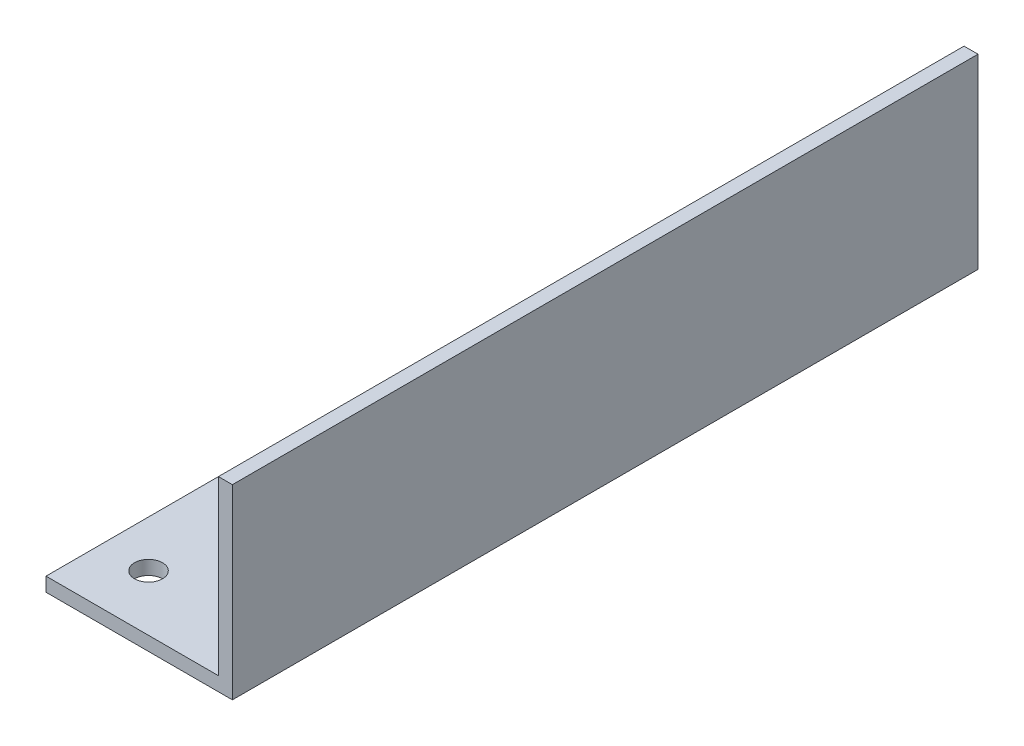
ISO-10303-21;
HEADER;
FILE_DESCRIPTION(('STEP AP214'),'2;1');
FILE_NAME('part.step','',(''),(''),'','','');
FILE_SCHEMA(('AUTOMOTIVE_DESIGN { 1 0 10303 214 1 1 1 1 }'));
ENDSEC;
DATA;
#1=APPLICATION_CONTEXT('core data for automotive mechanical design processes');
#2=APPLICATION_PROTOCOL_DEFINITION('international standard','automotive_design',2000,#1);
#3=PRODUCT_CONTEXT('',#1,'mechanical');
#4=PRODUCT('Part','Part','',(#3));
#5=PRODUCT_RELATED_PRODUCT_CATEGORY('part','',(#4));
#6=PRODUCT_DEFINITION_FORMATION('','',#4);
#7=PRODUCT_DEFINITION_CONTEXT('part definition',#1,'design');
#8=PRODUCT_DEFINITION('design','',#6,#7);
#9=PRODUCT_DEFINITION_SHAPE('','',#8);
#10=(LENGTH_UNIT() NAMED_UNIT(*) SI_UNIT(.MILLI.,.METRE.));
#11=(NAMED_UNIT(*) PLANE_ANGLE_UNIT() SI_UNIT($,.RADIAN.));
#12=(NAMED_UNIT(*) SI_UNIT($,.STERADIAN.) SOLID_ANGLE_UNIT());
#13=UNCERTAINTY_MEASURE_WITH_UNIT(LENGTH_MEASURE(1.E-05),#10,'distance_accuracy_value','');
#14=(GEOMETRIC_REPRESENTATION_CONTEXT(3) GLOBAL_UNCERTAINTY_ASSIGNED_CONTEXT((#13)) GLOBAL_UNIT_ASSIGNED_CONTEXT((#10,
#11,#12)) REPRESENTATION_CONTEXT('',''));
#15=CARTESIAN_POINT('',(0.,0.,0.));
#16=DIRECTION('',(0.,0.,1.));
#17=DIRECTION('',(1.,0.,0.));
#18=AXIS2_PLACEMENT_3D('',#15,#16,#17);
#19=CARTESIAN_POINT('',(-10.7868085352637,30.6298087141339,80.));
#20=DIRECTION('',(1.,0.,0.));
#21=DIRECTION('',(0.,0.,-1.));
#22=AXIS2_PLACEMENT_3D('',#19,#20,#21);
#23=PLANE('',#22);
#24=DIRECTION('',(0.,-1.,0.));
#25=VECTOR('',#24,1.);
#26=CARTESIAN_POINT('',(-10.7868085352637,30.6298087141339,0.));
#27=LINE('',#26,#25);
#28=CARTESIAN_POINT('',(-10.7868085352637,30.6298087141339,0.));
#29=VERTEX_POINT('',#28);
#30=CARTESIAN_POINT('',(-10.7868085352637,12.1298087141339,0.));
#31=VERTEX_POINT('',#30);
#32=EDGE_CURVE('E115',#29,#31,#27,.T.);
#33=ORIENTED_EDGE('',*,*,#32,.T.);
#34=DIRECTION('',(0.,0.,-1.));
#35=VECTOR('',#34,1.);
#36=CARTESIAN_POINT('',(-10.7868085352637,12.1298087141339,80.));
#37=LINE('',#36,#35);
#38=CARTESIAN_POINT('',(-10.7868085352637,12.1298087141339,80.));
#39=VERTEX_POINT('',#38);
#40=EDGE_CURVE('E11',#39,#31,#37,.T.);
#41=ORIENTED_EDGE('',*,*,#40,.F.);
#42=DIRECTION('',(0.,-1.,0.));
#43=VECTOR('',#42,1.);
#44=CARTESIAN_POINT('',(-10.7868085352637,30.6298087141339,80.));
#45=LINE('',#44,#43);
#46=CARTESIAN_POINT('',(-10.7868085352637,30.6298087141339,80.));
#47=VERTEX_POINT('',#46);
#48=EDGE_CURVE('E126',#47,#39,#45,.T.);
#49=ORIENTED_EDGE('',*,*,#48,.F.);
#50=DIRECTION('',(0.,0.,-1.));
#51=VECTOR('',#50,1.);
#52=CARTESIAN_POINT('',(-10.7868085352637,30.6298087141339,80.));
#53=LINE('',#52,#51);
#54=EDGE_CURVE('E111',#47,#29,#53,.T.);
#55=ORIENTED_EDGE('',*,*,#54,.T.);
#56=EDGE_LOOP('',(#33,#41,#49,#55));
#57=FACE_BOUND('',#56,.T.);
#58=ADVANCED_FACE('F31',(#57),#23,.F.);
#59=CARTESIAN_POINT('',(-10.7868085352637,12.1298087141339,80.));
#60=DIRECTION('',(0.,-1.,0.));
#61=DIRECTION('',(0.,0.,-1.));
#62=AXIS2_PLACEMENT_3D('',#59,#60,#61);
#63=PLANE('',#62);
#64=CARTESIAN_POINT('',(-19.2868085352637,12.1298087141339,40.));
#65=DIRECTION('',(0.,-1.,0.));
#66=DIRECTION('',(0.,0.,-1.));
#67=AXIS2_PLACEMENT_3D('',#64,#65,#66);
#68=CIRCLE('',#67,1.5);
#69=CARTESIAN_POINT('',(-19.2868085352637,12.1298087141339,38.5));
#70=VERTEX_POINT('',#69);
#71=EDGE_CURVE('E204',#70,#70,#68,.T.);
#72=ORIENTED_EDGE('',*,*,#71,.T.);
#73=EDGE_LOOP('',(#72));
#74=FACE_BOUND('',#73,.T.);
#75=CARTESIAN_POINT('',(-24.2868085352637,12.1298087141339,10.));
#76=DIRECTION('',(0.,-1.,0.));
#77=DIRECTION('',(0.,0.,-1.));
#78=AXIS2_PLACEMENT_3D('',#75,#76,#77);
#79=CIRCLE('',#78,1.5);
#80=CARTESIAN_POINT('',(-24.2868085352637,12.1298087141339,8.5));
#81=VERTEX_POINT('',#80);
#82=EDGE_CURVE('E200',#81,#81,#79,.T.);
#83=ORIENTED_EDGE('',*,*,#82,.T.);
#84=EDGE_LOOP('',(#83));
#85=FACE_BOUND('',#84,.T.);
#86=CARTESIAN_POINT('',(-14.2868085352637,12.1298087141339,16.));
#87=DIRECTION('',(0.,-1.,0.));
#88=DIRECTION('',(0.,0.,-1.));
#89=AXIS2_PLACEMENT_3D('',#86,#87,#88);
#90=CIRCLE('',#89,1.5);
#91=CARTESIAN_POINT('',(-14.2868085352637,12.1298087141339,14.5));
#92=VERTEX_POINT('',#91);
#93=EDGE_CURVE('E196',#92,#92,#90,.T.);
#94=ORIENTED_EDGE('',*,*,#93,.T.);
#95=EDGE_LOOP('',(#94));
#96=FACE_BOUND('',#95,.T.);
#97=CARTESIAN_POINT('',(-24.2868085352637,12.1298087141339,74.));
#98=DIRECTION('',(0.,-1.,0.));
#99=DIRECTION('',(0.,0.,-1.));
#100=AXIS2_PLACEMENT_3D('',#97,#98,#99);
#101=CIRCLE('',#100,1.5);
#102=CARTESIAN_POINT('',(-24.2868085352637,12.1298087141339,72.5));
#103=VERTEX_POINT('',#102);
#104=EDGE_CURVE('E186',#103,#103,#101,.T.);
#105=ORIENTED_EDGE('',*,*,#104,.T.);
#106=EDGE_LOOP('',(#105));
#107=FACE_BOUND('',#106,.T.);
#108=CARTESIAN_POINT('',(-14.2868085352637,12.1298087141339,74.));
#109=DIRECTION('',(0.,-1.,0.));
#110=DIRECTION('',(0.,0.,-1.));
#111=AXIS2_PLACEMENT_3D('',#108,#109,#110);
#112=CIRCLE('',#111,1.5);
#113=CARTESIAN_POINT('',(-14.2868085352637,12.1298087141339,72.5));
#114=VERTEX_POINT('',#113);
#115=EDGE_CURVE('E119',#114,#114,#112,.T.);
#116=ORIENTED_EDGE('',*,*,#115,.T.);
#117=EDGE_LOOP('',(#116));
#118=FACE_BOUND('',#117,.T.);
#119=DIRECTION('',(-1.,0.,0.));
#120=VECTOR('',#119,1.);
#121=CARTESIAN_POINT('',(-10.7868085352637,12.1298087141339,0.));
#122=LINE('',#121,#120);
#123=CARTESIAN_POINT('',(-29.2868085352637,12.1298087141339,0.));
#124=VERTEX_POINT('',#123);
#125=EDGE_CURVE('E118',#31,#124,#122,.T.);
#126=ORIENTED_EDGE('',*,*,#125,.T.);
#127=DIRECTION('',(0.,0.,-1.));
#128=VECTOR('',#127,1.);
#129=CARTESIAN_POINT('',(-29.2868085352637,12.1298087141339,80.));
#130=LINE('',#129,#128);
#131=CARTESIAN_POINT('',(-29.2868085352637,12.1298087141339,80.));
#132=VERTEX_POINT('',#131);
#133=EDGE_CURVE('E39',#132,#124,#130,.T.);
#134=ORIENTED_EDGE('',*,*,#133,.F.);
#135=DIRECTION('',(-1.,0.,0.));
#136=VECTOR('',#135,1.);
#137=CARTESIAN_POINT('',(-10.7868085352637,12.1298087141339,80.));
#138=LINE('',#137,#136);
#139=EDGE_CURVE('E84',#39,#132,#138,.T.);
#140=ORIENTED_EDGE('',*,*,#139,.F.);
#141=ORIENTED_EDGE('',*,*,#40,.T.);
#142=EDGE_LOOP('',(#126,#134,#140,#141));
#143=FACE_BOUND('',#142,.T.);
#144=ADVANCED_FACE('F150',(#74,#85,#96,#107,#118,#143),#63,.F.);
#145=CARTESIAN_POINT('',(-29.2868085352637,12.1298087141339,80.));
#146=DIRECTION('',(1.,0.,0.));
#147=DIRECTION('',(0.,0.,-1.));
#148=AXIS2_PLACEMENT_3D('',#145,#146,#147);
#149=PLANE('',#148);
#150=DIRECTION('',(0.,-1.,0.));
#151=VECTOR('',#150,1.);
#152=CARTESIAN_POINT('',(-29.2868085352637,12.1298087141339,0.));
#153=LINE('',#152,#151);
#154=CARTESIAN_POINT('',(-29.2868085352637,10.6298087141339,0.));
#155=VERTEX_POINT('',#154);
#156=EDGE_CURVE('E121',#124,#155,#153,.T.);
#157=ORIENTED_EDGE('',*,*,#156,.T.);
#158=DIRECTION('',(0.,0.,-1.));
#159=VECTOR('',#158,1.);
#160=CARTESIAN_POINT('',(-29.2868085352637,10.6298087141339,80.));
#161=LINE('',#160,#159);
#162=CARTESIAN_POINT('',(-29.2868085352637,10.6298087141339,80.));
#163=VERTEX_POINT('',#162);
#164=EDGE_CURVE('E106',#163,#155,#161,.T.);
#165=ORIENTED_EDGE('',*,*,#164,.F.);
#166=DIRECTION('',(0.,-1.,0.));
#167=VECTOR('',#166,1.);
#168=CARTESIAN_POINT('',(-29.2868085352637,12.1298087141339,80.));
#169=LINE('',#168,#167);
#170=EDGE_CURVE('E97',#132,#163,#169,.T.);
#171=ORIENTED_EDGE('',*,*,#170,.F.);
#172=ORIENTED_EDGE('',*,*,#133,.T.);
#173=EDGE_LOOP('',(#157,#165,#171,#172));
#174=FACE_BOUND('',#173,.T.);
#175=ADVANCED_FACE('F132',(#174),#149,.F.);
#176=CARTESIAN_POINT('',(-29.2868085352637,10.6298087141339,80.));
#177=DIRECTION('',(0.,1.,0.));
#178=DIRECTION('',(0.,0.,1.));
#179=AXIS2_PLACEMENT_3D('',#176,#177,#178);
#180=PLANE('',#179);
#181=CARTESIAN_POINT('',(-19.2868085352637,10.6298087141339,40.));
#182=DIRECTION('',(0.,-1.,0.));
#183=DIRECTION('',(0.,0.,-1.));
#184=AXIS2_PLACEMENT_3D('',#181,#182,#183);
#185=CIRCLE('',#184,1.5);
#186=CARTESIAN_POINT('',(-19.2868085352637,10.6298087141339,38.5));
#187=VERTEX_POINT('',#186);
#188=EDGE_CURVE('E169',#187,#187,#185,.T.);
#189=ORIENTED_EDGE('',*,*,#188,.F.);
#190=EDGE_LOOP('',(#189));
#191=FACE_BOUND('',#190,.T.);
#192=CARTESIAN_POINT('',(-24.2868085352637,10.6298087141339,10.));
#193=DIRECTION('',(0.,-1.,0.));
#194=DIRECTION('',(0.,0.,-1.));
#195=AXIS2_PLACEMENT_3D('',#192,#193,#194);
#196=CIRCLE('',#195,1.5);
#197=CARTESIAN_POINT('',(-24.2868085352637,10.6298087141339,8.5));
#198=VERTEX_POINT('',#197);
#199=EDGE_CURVE('E173',#198,#198,#196,.T.);
#200=ORIENTED_EDGE('',*,*,#199,.F.);
#201=EDGE_LOOP('',(#200));
#202=FACE_BOUND('',#201,.T.);
#203=CARTESIAN_POINT('',(-14.2868085352637,10.6298087141339,16.));
#204=DIRECTION('',(0.,-1.,0.));
#205=DIRECTION('',(0.,0.,-1.));
#206=AXIS2_PLACEMENT_3D('',#203,#204,#205);
#207=CIRCLE('',#206,1.5);
#208=CARTESIAN_POINT('',(-14.2868085352637,10.6298087141339,14.5));
#209=VERTEX_POINT('',#208);
#210=EDGE_CURVE('E177',#209,#209,#207,.T.);
#211=ORIENTED_EDGE('',*,*,#210,.F.);
#212=EDGE_LOOP('',(#211));
#213=FACE_BOUND('',#212,.T.);
#214=CARTESIAN_POINT('',(-24.2868085352637,10.6298087141339,74.));
#215=DIRECTION('',(0.,-1.,0.));
#216=DIRECTION('',(0.,0.,-1.));
#217=AXIS2_PLACEMENT_3D('',#214,#215,#216);
#218=CIRCLE('',#217,1.5);
#219=CARTESIAN_POINT('',(-24.2868085352637,10.6298087141339,72.5));
#220=VERTEX_POINT('',#219);
#221=EDGE_CURVE('E181',#220,#220,#218,.T.);
#222=ORIENTED_EDGE('',*,*,#221,.F.);
#223=EDGE_LOOP('',(#222));
#224=FACE_BOUND('',#223,.T.);
#225=CARTESIAN_POINT('',(-14.2868085352637,10.6298087141339,74.));
#226=DIRECTION('',(0.,-1.,0.));
#227=DIRECTION('',(0.,0.,-1.));
#228=AXIS2_PLACEMENT_3D('',#225,#226,#227);
#229=CIRCLE('',#228,1.5);
#230=CARTESIAN_POINT('',(-14.2868085352637,10.6298087141339,72.5));
#231=VERTEX_POINT('',#230);
#232=EDGE_CURVE('E184',#231,#231,#229,.T.);
#233=ORIENTED_EDGE('',*,*,#232,.F.);
#234=EDGE_LOOP('',(#233));
#235=FACE_BOUND('',#234,.T.);
#236=DIRECTION('',(1.,0.,0.));
#237=VECTOR('',#236,1.);
#238=CARTESIAN_POINT('',(-29.2868085352637,10.6298087141339,0.));
#239=LINE('',#238,#237);
#240=CARTESIAN_POINT('',(-9.28680853526371,10.6298087141339,0.));
#241=VERTEX_POINT('',#240);
#242=EDGE_CURVE('E105',#155,#241,#239,.T.);
#243=ORIENTED_EDGE('',*,*,#242,.T.);
#244=DIRECTION('',(0.,0.,-1.));
#245=VECTOR('',#244,1.);
#246=CARTESIAN_POINT('',(-9.28680853526371,10.6298087141339,80.));
#247=LINE('',#246,#245);
#248=CARTESIAN_POINT('',(-9.28680853526371,10.6298087141339,80.));
#249=VERTEX_POINT('',#248);
#250=EDGE_CURVE('E102',#249,#241,#247,.T.);
#251=ORIENTED_EDGE('',*,*,#250,.F.);
#252=DIRECTION('',(1.,0.,0.));
#253=VECTOR('',#252,1.);
#254=CARTESIAN_POINT('',(-29.2868085352637,10.6298087141339,80.));
#255=LINE('',#254,#253);
#256=EDGE_CURVE('E91',#163,#249,#255,.T.);
#257=ORIENTED_EDGE('',*,*,#256,.F.);
#258=ORIENTED_EDGE('',*,*,#164,.T.);
#259=EDGE_LOOP('',(#243,#251,#257,#258));
#260=FACE_BOUND('',#259,.T.);
#261=ADVANCED_FACE('F103',(#191,#202,#213,#224,#235,#260),#180,.F.);
#262=CARTESIAN_POINT('',(-9.28680853526371,10.6298087141339,80.));
#263=DIRECTION('',(-1.,0.,0.));
#264=DIRECTION('',(0.,0.,1.));
#265=AXIS2_PLACEMENT_3D('',#262,#263,#264);
#266=PLANE('',#265);
#267=DIRECTION('',(0.,1.,0.));
#268=VECTOR('',#267,1.);
#269=CARTESIAN_POINT('',(-9.28680853526371,10.6298087141339,0.));
#270=LINE('',#269,#268);
#271=CARTESIAN_POINT('',(-9.28680853526371,30.6298087141339,0.));
#272=VERTEX_POINT('',#271);
#273=EDGE_CURVE('E70',#241,#272,#270,.T.);
#274=ORIENTED_EDGE('',*,*,#273,.T.);
#275=DIRECTION('',(0.,0.,-1.));
#276=VECTOR('',#275,1.);
#277=CARTESIAN_POINT('',(-9.28680853526371,30.6298087141339,80.));
#278=LINE('',#277,#276);
#279=CARTESIAN_POINT('',(-9.28680853526371,30.6298087141339,80.));
#280=VERTEX_POINT('',#279);
#281=EDGE_CURVE('E107',#280,#272,#278,.T.);
#282=ORIENTED_EDGE('',*,*,#281,.F.);
#283=DIRECTION('',(0.,1.,0.));
#284=VECTOR('',#283,1.);
#285=CARTESIAN_POINT('',(-9.28680853526371,10.6298087141339,80.));
#286=LINE('',#285,#284);
#287=EDGE_CURVE('E95',#249,#280,#286,.T.);
#288=ORIENTED_EDGE('',*,*,#287,.F.);
#289=ORIENTED_EDGE('',*,*,#250,.T.);
#290=EDGE_LOOP('',(#274,#282,#288,#289));
#291=FACE_BOUND('',#290,.T.);
#292=ADVANCED_FACE('F109',(#291),#266,.F.);
#293=CARTESIAN_POINT('',(-9.28680853526371,30.6298087141339,80.));
#294=DIRECTION('',(0.,-1.,0.));
#295=DIRECTION('',(0.,0.,-1.));
#296=AXIS2_PLACEMENT_3D('',#293,#294,#295);
#297=PLANE('',#296);
#298=DIRECTION('',(-1.,0.,0.));
#299=VECTOR('',#298,1.);
#300=CARTESIAN_POINT('',(-9.28680853526371,30.6298087141339,0.));
#301=LINE('',#300,#299);
#302=EDGE_CURVE('E76',#272,#29,#301,.T.);
#303=ORIENTED_EDGE('',*,*,#302,.T.);
#304=ORIENTED_EDGE('',*,*,#54,.F.);
#305=DIRECTION('',(-1.,0.,0.));
#306=VECTOR('',#305,1.);
#307=CARTESIAN_POINT('',(-9.28680853526371,30.6298087141339,80.));
#308=LINE('',#307,#306);
#309=EDGE_CURVE('E47',#280,#47,#308,.T.);
#310=ORIENTED_EDGE('',*,*,#309,.F.);
#311=ORIENTED_EDGE('',*,*,#281,.T.);
#312=EDGE_LOOP('',(#303,#304,#310,#311));
#313=FACE_BOUND('',#312,.T.);
#314=ADVANCED_FACE('F139',(#313),#297,.F.);
#315=CARTESIAN_POINT('',(-10.7868085352637,12.1298087141339,80.));
#316=DIRECTION('',(0.,0.,-1.));
#317=DIRECTION('',(-1.,0.,0.));
#318=AXIS2_PLACEMENT_3D('',#315,#316,#317);
#319=PLANE('',#318);
#320=ORIENTED_EDGE('',*,*,#48,.T.);
#321=ORIENTED_EDGE('',*,*,#139,.T.);
#322=ORIENTED_EDGE('',*,*,#170,.T.);
#323=ORIENTED_EDGE('',*,*,#256,.T.);
#324=ORIENTED_EDGE('',*,*,#287,.T.);
#325=ORIENTED_EDGE('',*,*,#309,.T.);
#326=EDGE_LOOP('',(#320,#321,#322,#323,#324,#325));
#327=FACE_BOUND('',#326,.T.);
#328=ADVANCED_FACE('F93',(#327),#319,.F.);
#329=CARTESIAN_POINT('',(-10.7868085352637,12.1298087141339,0.));
#330=DIRECTION('',(0.,0.,-1.));
#331=DIRECTION('',(-1.,0.,0.));
#332=AXIS2_PLACEMENT_3D('',#329,#330,#331);
#333=PLANE('',#332);
#334=ORIENTED_EDGE('',*,*,#32,.F.);
#335=ORIENTED_EDGE('',*,*,#302,.F.);
#336=ORIENTED_EDGE('',*,*,#273,.F.);
#337=ORIENTED_EDGE('',*,*,#242,.F.);
#338=ORIENTED_EDGE('',*,*,#156,.F.);
#339=ORIENTED_EDGE('',*,*,#125,.F.);
#340=EDGE_LOOP('',(#334,#335,#336,#337,#338,#339));
#341=FACE_BOUND('',#340,.T.);
#342=ADVANCED_FACE('F135',(#341),#333,.T.);
#343=CARTESIAN_POINT('',(-14.2868085352637,90.6298087141339,74.));
#344=DIRECTION('',(0.,-1.,0.));
#345=DIRECTION('',(0.,0.,-1.));
#346=AXIS2_PLACEMENT_3D('',#343,#344,#345);
#347=CYLINDRICAL_SURFACE('',#346,1.5);
#348=ORIENTED_EDGE('',*,*,#232,.T.);
#349=EDGE_LOOP('',(#348));
#350=FACE_BOUND('',#349,.T.);
#351=ORIENTED_EDGE('',*,*,#115,.F.);
#352=EDGE_LOOP('',(#351));
#353=FACE_BOUND('',#352,.T.);
#354=ADVANCED_FACE('F226',(#350,#353),#347,.F.);
#355=CARTESIAN_POINT('',(-24.2868085352637,90.6298087141339,74.));
#356=DIRECTION('',(0.,-1.,0.));
#357=DIRECTION('',(0.,0.,-1.));
#358=AXIS2_PLACEMENT_3D('',#355,#356,#357);
#359=CYLINDRICAL_SURFACE('',#358,1.5);
#360=ORIENTED_EDGE('',*,*,#221,.T.);
#361=EDGE_LOOP('',(#360));
#362=FACE_BOUND('',#361,.T.);
#363=ORIENTED_EDGE('',*,*,#104,.F.);
#364=EDGE_LOOP('',(#363));
#365=FACE_BOUND('',#364,.T.);
#366=ADVANCED_FACE('F222',(#362,#365),#359,.F.);
#367=CARTESIAN_POINT('',(-14.2868085352637,90.6298087141339,16.));
#368=DIRECTION('',(0.,-1.,0.));
#369=DIRECTION('',(0.,0.,-1.));
#370=AXIS2_PLACEMENT_3D('',#367,#368,#369);
#371=CYLINDRICAL_SURFACE('',#370,1.5);
#372=ORIENTED_EDGE('',*,*,#210,.T.);
#373=EDGE_LOOP('',(#372));
#374=FACE_BOUND('',#373,.T.);
#375=ORIENTED_EDGE('',*,*,#93,.F.);
#376=EDGE_LOOP('',(#375));
#377=FACE_BOUND('',#376,.T.);
#378=ADVANCED_FACE('F216',(#374,#377),#371,.F.);
#379=CARTESIAN_POINT('',(-24.2868085352637,90.6298087141339,10.));
#380=DIRECTION('',(0.,-1.,0.));
#381=DIRECTION('',(0.,0.,-1.));
#382=AXIS2_PLACEMENT_3D('',#379,#380,#381);
#383=CYLINDRICAL_SURFACE('',#382,1.5);
#384=ORIENTED_EDGE('',*,*,#199,.T.);
#385=EDGE_LOOP('',(#384));
#386=FACE_BOUND('',#385,.T.);
#387=ORIENTED_EDGE('',*,*,#82,.F.);
#388=EDGE_LOOP('',(#387));
#389=FACE_BOUND('',#388,.T.);
#390=ADVANCED_FACE('F210',(#386,#389),#383,.F.);
#391=CARTESIAN_POINT('',(-19.2868085352637,90.6298087141339,40.));
#392=DIRECTION('',(0.,-1.,0.));
#393=DIRECTION('',(0.,0.,-1.));
#394=AXIS2_PLACEMENT_3D('',#391,#392,#393);
#395=CYLINDRICAL_SURFACE('',#394,1.5);
#396=ORIENTED_EDGE('',*,*,#188,.T.);
#397=EDGE_LOOP('',(#396));
#398=FACE_BOUND('',#397,.T.);
#399=ORIENTED_EDGE('',*,*,#71,.F.);
#400=EDGE_LOOP('',(#399));
#401=FACE_BOUND('',#400,.T.);
#402=ADVANCED_FACE('F207',(#398,#401),#395,.F.);
#403=CLOSED_SHELL('',(#58,#144,#175,#261,#292,#314,#328,#342,#354,#366,#378,#390,#402));
#404=MANIFOLD_SOLID_BREP('B2',#403);
#405=ADVANCED_BREP_SHAPE_REPRESENTATION('',(#18,#404),#14);
#406=SHAPE_DEFINITION_REPRESENTATION(#9,#405);
ENDSEC;
END-ISO-10303-21;
